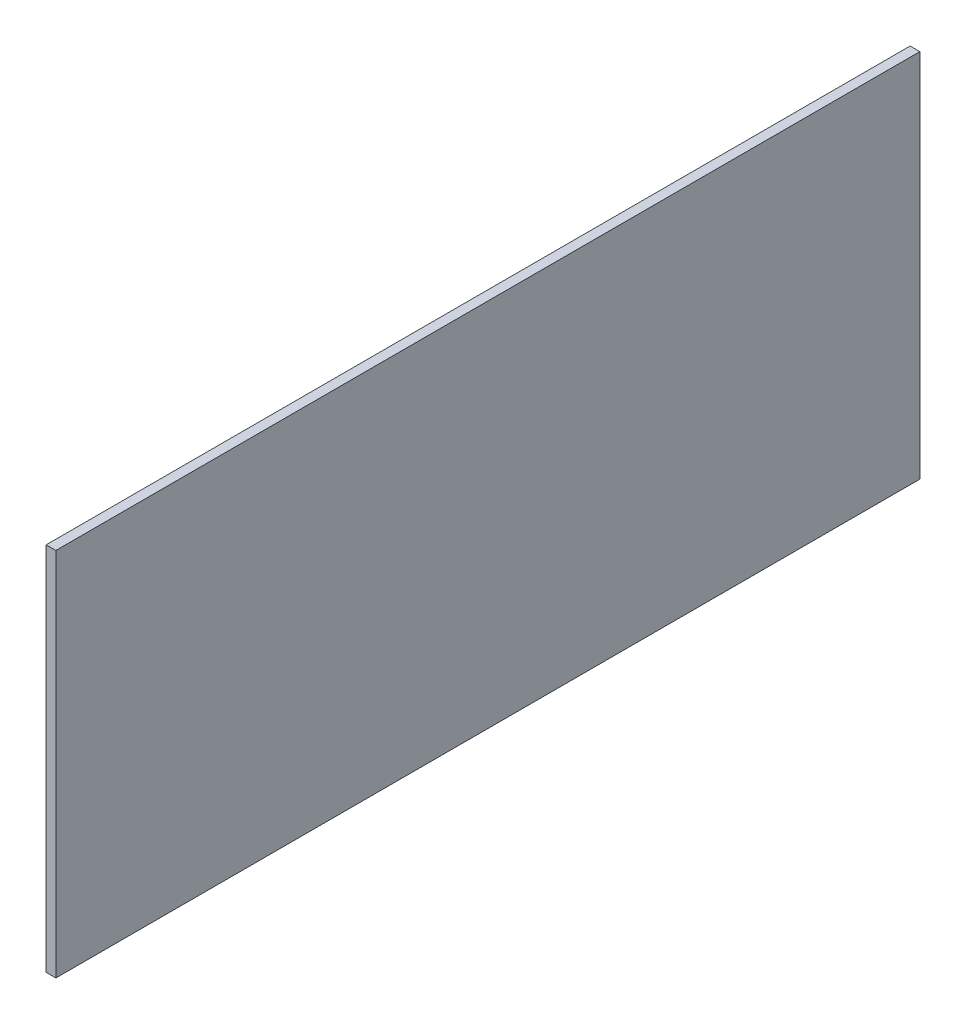
ISO-10303-21;
HEADER;
FILE_DESCRIPTION(('STEP AP214'),'2;1');
FILE_NAME('part.step','',(''),(''),'','','');
FILE_SCHEMA(('AUTOMOTIVE_DESIGN { 1 0 10303 214 1 1 1 1 }'));
ENDSEC;
DATA;
#1=APPLICATION_CONTEXT('core data for automotive mechanical design processes');
#2=APPLICATION_PROTOCOL_DEFINITION('international standard','automotive_design',2000,#1);
#3=PRODUCT_CONTEXT('',#1,'mechanical');
#4=PRODUCT('Part','Part','',(#3));
#5=PRODUCT_RELATED_PRODUCT_CATEGORY('part','',(#4));
#6=PRODUCT_DEFINITION_FORMATION('','',#4);
#7=PRODUCT_DEFINITION_CONTEXT('part definition',#1,'design');
#8=PRODUCT_DEFINITION('design','',#6,#7);
#9=PRODUCT_DEFINITION_SHAPE('','',#8);
#10=(LENGTH_UNIT() NAMED_UNIT(*) SI_UNIT(.MILLI.,.METRE.));
#11=(NAMED_UNIT(*) PLANE_ANGLE_UNIT() SI_UNIT($,.RADIAN.));
#12=(NAMED_UNIT(*) SI_UNIT($,.STERADIAN.) SOLID_ANGLE_UNIT());
#13=UNCERTAINTY_MEASURE_WITH_UNIT(LENGTH_MEASURE(1.E-05),#10,'distance_accuracy_value','');
#14=(GEOMETRIC_REPRESENTATION_CONTEXT(3) GLOBAL_UNCERTAINTY_ASSIGNED_CONTEXT((#13)) GLOBAL_UNIT_ASSIGNED_CONTEXT((#10,
#11,#12)) REPRESENTATION_CONTEXT('',''));
#15=CARTESIAN_POINT('',(0.,0.,0.));
#16=DIRECTION('',(0.,0.,1.));
#17=DIRECTION('',(1.,0.,0.));
#18=AXIS2_PLACEMENT_3D('',#15,#16,#17);
#19=CARTESIAN_POINT('',(2.000000064,38.1,-88.9));
#20=DIRECTION('',(0.,0.,1.));
#21=DIRECTION('',(0.,-1.,0.));
#22=AXIS2_PLACEMENT_3D('',#19,#20,#21);
#23=PLANE('',#22);
#24=DIRECTION('',(0.,1.,0.));
#25=VECTOR('',#24,1.);
#26=CARTESIAN_POINT('',(0.,38.1,-88.9));
#27=LINE('',#26,#25);
#28=CARTESIAN_POINT('',(0.,-38.1,-88.9));
#29=VERTEX_POINT('',#28);
#30=CARTESIAN_POINT('',(0.,38.1,-88.9));
#31=VERTEX_POINT('',#30);
#32=EDGE_CURVE('E107',#29,#31,#27,.T.);
#33=ORIENTED_EDGE('',*,*,#32,.T.);
#34=DIRECTION('',(-1.,0.,0.));
#35=VECTOR('',#34,1.);
#36=CARTESIAN_POINT('',(2.000000064,38.1,-88.9));
#37=LINE('',#36,#35);
#38=CARTESIAN_POINT('',(2.000000064,38.1,-88.9));
#39=VERTEX_POINT('',#38);
#40=EDGE_CURVE('E11',#39,#31,#37,.T.);
#41=ORIENTED_EDGE('',*,*,#40,.F.);
#42=DIRECTION('',(0.,1.,0.));
#43=VECTOR('',#42,1.);
#44=CARTESIAN_POINT('',(2.000000064,38.1,-88.9));
#45=LINE('',#44,#43);
#46=CARTESIAN_POINT('',(2.000000064,-38.1,-88.9));
#47=VERTEX_POINT('',#46);
#48=EDGE_CURVE('E91',#47,#39,#45,.T.);
#49=ORIENTED_EDGE('',*,*,#48,.F.);
#50=DIRECTION('',(-1.,0.,0.));
#51=VECTOR('',#50,1.);
#52=CARTESIAN_POINT('',(2.000000064,-38.1,-88.9));
#53=LINE('',#52,#51);
#54=EDGE_CURVE('E103',#47,#29,#53,.T.);
#55=ORIENTED_EDGE('',*,*,#54,.T.);
#56=EDGE_LOOP('',(#33,#41,#49,#55));
#57=FACE_BOUND('',#56,.T.);
#58=ADVANCED_FACE('F39',(#57),#23,.F.);
#59=CARTESIAN_POINT('',(2.000000064,38.1,88.9));
#60=DIRECTION('',(0.,-1.,0.));
#61=DIRECTION('',(0.,0.,-1.));
#62=AXIS2_PLACEMENT_3D('',#59,#60,#61);
#63=PLANE('',#62);
#64=DIRECTION('',(0.,0.,1.));
#65=VECTOR('',#64,1.);
#66=CARTESIAN_POINT('',(0.,38.1,88.9));
#67=LINE('',#66,#65);
#68=CARTESIAN_POINT('',(0.,38.1,88.9));
#69=VERTEX_POINT('',#68);
#70=EDGE_CURVE('E96',#31,#69,#67,.T.);
#71=ORIENTED_EDGE('',*,*,#70,.T.);
#72=DIRECTION('',(-1.,0.,0.));
#73=VECTOR('',#72,1.);
#74=CARTESIAN_POINT('',(2.000000064,38.1,88.9));
#75=LINE('',#74,#73);
#76=CARTESIAN_POINT('',(2.000000064,38.1,88.9));
#77=VERTEX_POINT('',#76);
#78=EDGE_CURVE('E48',#77,#69,#75,.T.);
#79=ORIENTED_EDGE('',*,*,#78,.F.);
#80=DIRECTION('',(0.,0.,1.));
#81=VECTOR('',#80,1.);
#82=CARTESIAN_POINT('',(2.000000064,38.1,88.9));
#83=LINE('',#82,#81);
#84=EDGE_CURVE('E86',#39,#77,#83,.T.);
#85=ORIENTED_EDGE('',*,*,#84,.F.);
#86=ORIENTED_EDGE('',*,*,#40,.T.);
#87=EDGE_LOOP('',(#71,#79,#85,#86));
#88=FACE_BOUND('',#87,.T.);
#89=ADVANCED_FACE('F95',(#88),#63,.F.);
#90=CARTESIAN_POINT('',(2.000000064,38.1,88.9));
#91=DIRECTION('',(0.,0.,-1.));
#92=DIRECTION('',(0.,1.,0.));
#93=AXIS2_PLACEMENT_3D('',#90,#91,#92);
#94=PLANE('',#93);
#95=DIRECTION('',(0.,-1.,0.));
#96=VECTOR('',#95,1.);
#97=CARTESIAN_POINT('',(0.,38.1,88.9));
#98=LINE('',#97,#96);
#99=CARTESIAN_POINT('',(0.,-38.1,88.9));
#100=VERTEX_POINT('',#99);
#101=EDGE_CURVE('E73',#69,#100,#98,.T.);
#102=ORIENTED_EDGE('',*,*,#101,.T.);
#103=DIRECTION('',(-1.,0.,0.));
#104=VECTOR('',#103,1.);
#105=CARTESIAN_POINT('',(2.000000064,-38.1,88.9));
#106=LINE('',#105,#104);
#107=CARTESIAN_POINT('',(2.000000064,-38.1,88.9));
#108=VERTEX_POINT('',#107);
#109=EDGE_CURVE('E98',#108,#100,#106,.T.);
#110=ORIENTED_EDGE('',*,*,#109,.F.);
#111=DIRECTION('',(0.,-1.,0.));
#112=VECTOR('',#111,1.);
#113=CARTESIAN_POINT('',(2.000000064,38.1,88.9));
#114=LINE('',#113,#112);
#115=EDGE_CURVE('E89',#77,#108,#114,.T.);
#116=ORIENTED_EDGE('',*,*,#115,.F.);
#117=ORIENTED_EDGE('',*,*,#78,.T.);
#118=EDGE_LOOP('',(#102,#110,#116,#117));
#119=FACE_BOUND('',#118,.T.);
#120=ADVANCED_FACE('F99',(#119),#94,.F.);
#121=CARTESIAN_POINT('',(2.000000064,-38.1,88.9));
#122=DIRECTION('',(0.,1.,0.));
#123=DIRECTION('',(0.,0.,1.));
#124=AXIS2_PLACEMENT_3D('',#121,#122,#123);
#125=PLANE('',#124);
#126=DIRECTION('',(0.,0.,-1.));
#127=VECTOR('',#126,1.);
#128=CARTESIAN_POINT('',(0.,-38.1,88.9));
#129=LINE('',#128,#127);
#130=EDGE_CURVE('E79',#100,#29,#129,.T.);
#131=ORIENTED_EDGE('',*,*,#130,.T.);
#132=ORIENTED_EDGE('',*,*,#54,.F.);
#133=DIRECTION('',(0.,0.,-1.));
#134=VECTOR('',#133,1.);
#135=CARTESIAN_POINT('',(2.000000064,-38.1,88.9));
#136=LINE('',#135,#134);
#137=EDGE_CURVE('E56',#108,#47,#136,.T.);
#138=ORIENTED_EDGE('',*,*,#137,.F.);
#139=ORIENTED_EDGE('',*,*,#109,.T.);
#140=EDGE_LOOP('',(#131,#132,#138,#139));
#141=FACE_BOUND('',#140,.T.);
#142=ADVANCED_FACE('F120',(#141),#125,.F.);
#143=CARTESIAN_POINT('',(2.000000064,0.,0.));
#144=DIRECTION('',(1.,0.,0.));
#145=DIRECTION('',(0.,0.,-1.));
#146=AXIS2_PLACEMENT_3D('',#143,#144,#145);
#147=PLANE('',#146);
#148=ORIENTED_EDGE('',*,*,#48,.T.);
#149=ORIENTED_EDGE('',*,*,#84,.T.);
#150=ORIENTED_EDGE('',*,*,#115,.T.);
#151=ORIENTED_EDGE('',*,*,#137,.T.);
#152=EDGE_LOOP('',(#148,#149,#150,#151));
#153=FACE_BOUND('',#152,.T.);
#154=ADVANCED_FACE('F87',(#153),#147,.T.);
#155=CARTESIAN_POINT('',(0.,0.,0.));
#156=DIRECTION('',(1.,0.,0.));
#157=DIRECTION('',(0.,0.,-1.));
#158=AXIS2_PLACEMENT_3D('',#155,#156,#157);
#159=PLANE('',#158);
#160=ORIENTED_EDGE('',*,*,#32,.F.);
#161=ORIENTED_EDGE('',*,*,#130,.F.);
#162=ORIENTED_EDGE('',*,*,#101,.F.);
#163=ORIENTED_EDGE('',*,*,#70,.F.);
#164=EDGE_LOOP('',(#160,#161,#162,#163));
#165=FACE_BOUND('',#164,.T.);
#166=ADVANCED_FACE('F123',(#165),#159,.F.);
#167=CLOSED_SHELL('',(#58,#89,#120,#142,#154,#166));
#168=MANIFOLD_SOLID_BREP('B2',#167);
#169=ADVANCED_BREP_SHAPE_REPRESENTATION('',(#18,#168),#14);
#170=SHAPE_DEFINITION_REPRESENTATION(#9,#169);
ENDSEC;
END-ISO-10303-21;
